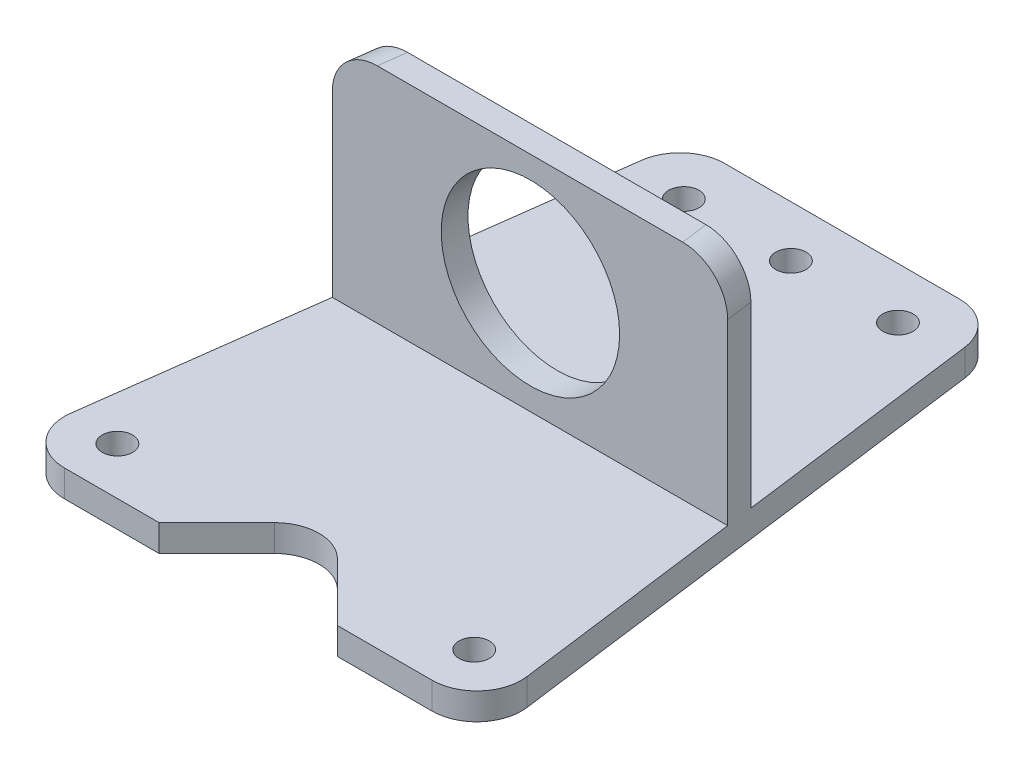
ISO-10303-21;
HEADER;
FILE_DESCRIPTION(('STEP AP214'),'2;1');
FILE_NAME('part.step','',(''),(''),'','','');
FILE_SCHEMA(('AUTOMOTIVE_DESIGN { 1 0 10303 214 1 1 1 1 }'));
ENDSEC;
DATA;
#1=APPLICATION_CONTEXT('core data for automotive mechanical design processes');
#2=APPLICATION_PROTOCOL_DEFINITION('international standard','automotive_design',2000,#1);
#3=PRODUCT_CONTEXT('',#1,'mechanical');
#4=PRODUCT('Part','Part','',(#3));
#5=PRODUCT_RELATED_PRODUCT_CATEGORY('part','',(#4));
#6=PRODUCT_DEFINITION_FORMATION('','',#4);
#7=PRODUCT_DEFINITION_CONTEXT('part definition',#1,'design');
#8=PRODUCT_DEFINITION('design','',#6,#7);
#9=PRODUCT_DEFINITION_SHAPE('','',#8);
#10=(LENGTH_UNIT() NAMED_UNIT(*) SI_UNIT(.MILLI.,.METRE.));
#11=(NAMED_UNIT(*) PLANE_ANGLE_UNIT() SI_UNIT($,.RADIAN.));
#12=(NAMED_UNIT(*) SI_UNIT($,.STERADIAN.) SOLID_ANGLE_UNIT());
#13=UNCERTAINTY_MEASURE_WITH_UNIT(LENGTH_MEASURE(1.E-05),#10,'distance_accuracy_value','');
#14=(GEOMETRIC_REPRESENTATION_CONTEXT(3) GLOBAL_UNCERTAINTY_ASSIGNED_CONTEXT((#13)) GLOBAL_UNIT_ASSIGNED_CONTEXT((#10,
#11,#12)) REPRESENTATION_CONTEXT('',''));
#15=CARTESIAN_POINT('',(0.,0.,0.));
#16=DIRECTION('',(0.,0.,1.));
#17=DIRECTION('',(1.,0.,0.));
#18=AXIS2_PLACEMENT_3D('',#15,#16,#17);
#19=CARTESIAN_POINT('',(0.,3.,549.377139365234));
#20=DIRECTION('',(0.,0.,-1.));
#21=DIRECTION('',(-1.,0.,0.));
#22=AXIS2_PLACEMENT_3D('',#19,#20,#21);
#23=PLANE('',#22);
#24=DIRECTION('',(1.,0.,0.));
#25=VECTOR('',#24,1.);
#26=CARTESIAN_POINT('',(0.,3.,549.377139365234));
#27=LINE('',#26,#25);
#28=CARTESIAN_POINT('',(-20.6154451047069,3.,549.377139365234));
#29=VERTEX_POINT('',#28);
#30=CARTESIAN_POINT('',(-9.99999999999981,3.,549.377139365234));
#31=VERTEX_POINT('',#30);
#32=EDGE_CURVE('E200',#29,#31,#27,.T.);
#33=ORIENTED_EDGE('',*,*,#32,.F.);
#34=DIRECTION('',(0.,-1.,0.));
#35=VECTOR('',#34,1.);
#36=CARTESIAN_POINT('',(-20.6154451047069,3.,549.377139365234));
#37=LINE('',#36,#35);
#38=CARTESIAN_POINT('',(-20.6154451047069,0.,549.377139365234));
#39=VERTEX_POINT('',#38);
#40=EDGE_CURVE('E316',#29,#39,#37,.T.);
#41=ORIENTED_EDGE('',*,*,#40,.T.);
#42=DIRECTION('',(1.,0.,0.));
#43=VECTOR('',#42,1.);
#44=CARTESIAN_POINT('',(0.,0.,549.377139365234));
#45=LINE('',#44,#43);
#46=CARTESIAN_POINT('',(-9.99999999999981,0.,549.377139365234));
#47=VERTEX_POINT('',#46);
#48=EDGE_CURVE('E243',#39,#47,#45,.T.);
#49=ORIENTED_EDGE('',*,*,#48,.T.);
#50=DIRECTION('',(0.,1.,0.));
#51=VECTOR('',#50,1.);
#52=CARTESIAN_POINT('',(-9.99999999999981,-7.,549.377139365234));
#53=LINE('',#52,#51);
#54=EDGE_CURVE('E184',#47,#31,#53,.T.);
#55=ORIENTED_EDGE('',*,*,#54,.T.);
#56=EDGE_LOOP('',(#33,#41,#49,#55));
#57=FACE_BOUND('',#56,.T.);
#58=ADVANCED_FACE('F45',(#57),#23,.F.);
#59=CARTESIAN_POINT('',(0.,3.,0.));
#60=DIRECTION('',(0.,1.,0.));
#61=DIRECTION('',(0.,0.,1.));
#62=AXIS2_PLACEMENT_3D('',#59,#60,#61);
#63=PLANE('',#62);
#64=DIRECTION('',(0.130449390800948,0.,0.991454969446249));
#65=VECTOR('',#64,1.);
#66=CARTESIAN_POINT('',(-45.1849462242018,3.,5.94515019841279));
#67=LINE('',#66,#65);
#68=CARTESIAN_POINT('',(18.1297543305561,3.,487.156094293981));
#69=VERTEX_POINT('',#68);
#70=CARTESIAN_POINT('',(21.7670135450569,3.,514.800368454553));
#71=VERTEX_POINT('',#70);
#72=EDGE_CURVE('E210',#69,#71,#67,.T.);
#73=ORIENTED_EDGE('',*,*,#72,.F.);
#74=CARTESIAN_POINT('',(13.1724794833249,3.,487.808341247986));
#75=DIRECTION('',(0.,1.,0.));
#76=DIRECTION('',(0.,0.,1.));
#77=AXIS2_PLACEMENT_3D('',#74,#75,#76);
#78=CIRCLE('',#77,5.);
#79=CARTESIAN_POINT('',(13.1724794833249,3.,482.808341247986));
#80=VERTEX_POINT('',#79);
#81=EDGE_CURVE('E61',#69,#80,#78,.T.);
#82=ORIENTED_EDGE('',*,*,#81,.T.);
#83=DIRECTION('',(1.,0.,0.));
#84=VECTOR('',#83,1.);
#85=CARTESIAN_POINT('',(0.,3.,482.808341247986));
#86=LINE('',#85,#84);
#87=CARTESIAN_POINT('',(-13.1724794833249,3.,482.808341247986));
#88=VERTEX_POINT('',#87);
#89=EDGE_CURVE('E214',#88,#80,#86,.T.);
#90=ORIENTED_EDGE('',*,*,#89,.F.);
#91=CARTESIAN_POINT('',(-13.1724794833249,3.,487.808341247986));
#92=DIRECTION('',(0.,1.,0.));
#93=DIRECTION('',(0.,0.,1.));
#94=AXIS2_PLACEMENT_3D('',#91,#92,#93);
#95=CIRCLE('',#94,5.);
#96=CARTESIAN_POINT('',(-18.1297543305561,3.,487.156094293981));
#97=VERTEX_POINT('',#96);
#98=EDGE_CURVE('E356',#88,#97,#95,.T.);
#99=ORIENTED_EDGE('',*,*,#98,.T.);
#100=DIRECTION('',(-0.130449390800948,0.,0.991454969446249));
#101=VECTOR('',#100,1.);
#102=CARTESIAN_POINT('',(45.1849462242018,3.,5.94515019841279));
#103=LINE('',#102,#101);
#104=CARTESIAN_POINT('',(-21.7670135450569,3.,514.800368454553));
#105=VERTEX_POINT('',#104);
#106=EDGE_CURVE('E201',#97,#105,#103,.T.);
#107=ORIENTED_EDGE('',*,*,#106,.T.);
#108=DIRECTION('',(-1.,0.,0.));
#109=VECTOR('',#108,1.);
#110=CARTESIAN_POINT('',(21.7670135450569,3.,514.800368454553));
#111=LINE('',#110,#109);
#112=EDGE_CURVE('E397',#71,#105,#111,.T.);
#113=ORIENTED_EDGE('',*,*,#112,.F.);
#114=EDGE_LOOP('',(#73,#82,#90,#99,#107,#113));
#115=FACE_BOUND('',#114,.T.);
#116=CARTESIAN_POINT('',(12.,3.,488.550368454553));
#117=DIRECTION('',(0.,1.,0.));
#118=DIRECTION('',(0.,0.,1.));
#119=AXIS2_PLACEMENT_3D('',#116,#117,#118);
#120=CIRCLE('',#119,1.69999999999994);
#121=CARTESIAN_POINT('',(12.,3.,490.250368454553));
#122=VERTEX_POINT('',#121);
#123=EDGE_CURVE('E225',#122,#122,#120,.F.);
#124=ORIENTED_EDGE('',*,*,#123,.T.);
#125=EDGE_LOOP('',(#124));
#126=FACE_BOUND('',#125,.T.);
#127=CARTESIAN_POINT('',(-12.,3.,488.550368454553));
#128=DIRECTION('',(0.,1.,0.));
#129=DIRECTION('',(0.,0.,1.));
#130=AXIS2_PLACEMENT_3D('',#127,#128,#129);
#131=CIRCLE('',#130,1.69999999999994);
#132=CARTESIAN_POINT('',(-12.,3.,490.250368454553));
#133=VERTEX_POINT('',#132);
#134=EDGE_CURVE('E221',#133,#133,#131,.T.);
#135=ORIENTED_EDGE('',*,*,#134,.F.);
#136=EDGE_LOOP('',(#135));
#137=FACE_BOUND('',#136,.T.);
#138=CARTESIAN_POINT('',(1.044746928557E-13,3.,488.550368454553));
#139=DIRECTION('',(0.,1.,0.));
#140=DIRECTION('',(0.,0.,1.));
#141=AXIS2_PLACEMENT_3D('',#138,#139,#140);
#142=CIRCLE('',#141,1.69999999999999);
#143=CARTESIAN_POINT('',(1.044746928557E-13,3.,490.250368454553));
#144=VERTEX_POINT('',#143);
#145=EDGE_CURVE('E217',#144,#144,#142,.T.);
#146=ORIENTED_EDGE('',*,*,#145,.F.);
#147=EDGE_LOOP('',(#146));
#148=FACE_BOUND('',#147,.T.);
#149=ADVANCED_FACE('F453',(#115,#126,#137,#148),#63,.T.);
#150=CARTESIAN_POINT('',(45.1849462242018,3.,5.94515019841279));
#151=DIRECTION('',(0.991454969446248,0.,0.130449390800948));
#152=DIRECTION('',(0.130449390800948,0.,-0.991454969446249));
#153=AXIS2_PLACEMENT_3D('',#150,#151,#152);
#154=PLANE('',#153);
#155=DIRECTION('',(-0.130449390800948,0.,0.991454969446249));
#156=VECTOR('',#155,1.);
#157=CARTESIAN_POINT('',(45.1849462242018,0.,5.94515019841279));
#158=LINE('',#157,#156);
#159=CARTESIAN_POINT('',(-18.1297543305561,0.,487.156094293981));
#160=VERTEX_POINT('',#159);
#161=CARTESIAN_POINT('',(-25.5727199519381,0.,543.724892411229));
#162=VERTEX_POINT('',#161);
#163=EDGE_CURVE('E238',#160,#162,#158,.T.);
#164=ORIENTED_EDGE('',*,*,#163,.T.);
#165=DIRECTION('',(0.,-1.,0.));
#166=VECTOR('',#165,1.);
#167=CARTESIAN_POINT('',(-25.5727199519381,3.,543.724892411229));
#168=LINE('',#167,#166);
#169=CARTESIAN_POINT('',(-25.5727199519381,3.,543.724892411229));
#170=VERTEX_POINT('',#169);
#171=EDGE_CURVE('E327',#162,#170,#168,.F.);
#172=ORIENTED_EDGE('',*,*,#171,.T.);
#173=CARTESIAN_POINT('',(-22.1617346211148,3.,517.800368454553));
#174=VERTEX_POINT('',#173);
#175=EDGE_CURVE('E206',#174,#170,#103,.T.);
#176=ORIENTED_EDGE('',*,*,#175,.F.);
#177=DIRECTION('',(0.,-1.,0.));
#178=VECTOR('',#177,1.);
#179=CARTESIAN_POINT('',(-22.1617346211148,28.,517.800368454553));
#180=LINE('',#179,#178);
#181=CARTESIAN_POINT('',(-22.1617346211148,23.,517.800368454553));
#182=VERTEX_POINT('',#181);
#183=EDGE_CURVE('E234',#182,#174,#180,.T.);
#184=ORIENTED_EDGE('',*,*,#183,.F.);
#185=DIRECTION('',(-0.130449390800948,0.,0.991454969446249));
#186=VECTOR('',#185,1.);
#187=CARTESIAN_POINT('',(45.1849462242018,23.,5.94515019841279));
#188=LINE('',#187,#186);
#189=CARTESIAN_POINT('',(-21.7670135450569,23.,514.800368454553));
#190=VERTEX_POINT('',#189);
#191=EDGE_CURVE('E324',#182,#190,#188,.F.);
#192=ORIENTED_EDGE('',*,*,#191,.T.);
#193=DIRECTION('',(0.,-1.,0.));
#194=VECTOR('',#193,1.);
#195=CARTESIAN_POINT('',(-21.7670135450569,28.,514.800368454553));
#196=LINE('',#195,#194);
#197=EDGE_CURVE('E385',#190,#105,#196,.T.);
#198=ORIENTED_EDGE('',*,*,#197,.T.);
#199=ORIENTED_EDGE('',*,*,#106,.F.);
#200=DIRECTION('',(0.,-1.,0.));
#201=VECTOR('',#200,1.);
#202=CARTESIAN_POINT('',(-18.1297543305561,0.,487.156094293981));
#203=LINE('',#202,#201);
#204=EDGE_CURVE('E320',#97,#160,#203,.T.);
#205=ORIENTED_EDGE('',*,*,#204,.T.);
#206=EDGE_LOOP('',(#164,#172,#176,#184,#192,#198,#199,#205));
#207=FACE_BOUND('',#206,.T.);
#208=ADVANCED_FACE('F458',(#207),#154,.F.);
#209=CARTESIAN_POINT('',(10.,0.,549.377139365234));
#210=VERTEX_POINT('',#209);
#211=CARTESIAN_POINT('',(20.6154451047069,0.,549.377139365234));
#212=VERTEX_POINT('',#211);
#213=EDGE_CURVE('E242',#210,#212,#45,.T.);
#214=ORIENTED_EDGE('',*,*,#213,.T.);
#215=DIRECTION('',(0.,-1.,0.));
#216=VECTOR('',#215,1.);
#217=CARTESIAN_POINT('',(20.6154451047069,3.,549.377139365234));
#218=LINE('',#217,#216);
#219=CARTESIAN_POINT('',(20.6154451047069,3.,549.377139365234));
#220=VERTEX_POINT('',#219);
#221=EDGE_CURVE('E198',#212,#220,#218,.F.);
#222=ORIENTED_EDGE('',*,*,#221,.T.);
#223=CARTESIAN_POINT('',(10.,3.,549.377139365234));
#224=VERTEX_POINT('',#223);
#225=EDGE_CURVE('E191',#224,#220,#27,.T.);
#226=ORIENTED_EDGE('',*,*,#225,.F.);
#227=DIRECTION('',(0.,1.,0.));
#228=VECTOR('',#227,1.);
#229=CARTESIAN_POINT('',(10.,-7.,549.377139365234));
#230=LINE('',#229,#228);
#231=EDGE_CURVE('E172',#210,#224,#230,.T.);
#232=ORIENTED_EDGE('',*,*,#231,.F.);
#233=EDGE_LOOP('',(#214,#222,#226,#232));
#234=FACE_BOUND('',#233,.T.);
#235=ADVANCED_FACE('F196',(#234),#23,.F.);
#236=CARTESIAN_POINT('',(-45.1849462242018,3.,5.94515019841279));
#237=DIRECTION('',(0.991454969446248,0.,-0.130449390800948));
#238=DIRECTION('',(-0.130449390800948,0.,-0.991454969446249));
#239=AXIS2_PLACEMENT_3D('',#236,#237,#238);
#240=PLANE('',#239);
#241=CARTESIAN_POINT('',(22.161734621115,3.,517.800368454553));
#242=VERTEX_POINT('',#241);
#243=CARTESIAN_POINT('',(25.5727199519381,3.,543.724892411229));
#244=VERTEX_POINT('',#243);
#245=EDGE_CURVE('E205',#242,#244,#67,.T.);
#246=ORIENTED_EDGE('',*,*,#245,.T.);
#247=DIRECTION('',(0.,-1.,0.));
#248=VECTOR('',#247,1.);
#249=CARTESIAN_POINT('',(25.5727199519381,0.,543.724892411229));
#250=LINE('',#249,#248);
#251=CARTESIAN_POINT('',(25.5727199519381,0.,543.724892411229));
#252=VERTEX_POINT('',#251);
#253=EDGE_CURVE('E292',#244,#252,#250,.T.);
#254=ORIENTED_EDGE('',*,*,#253,.T.);
#255=DIRECTION('',(0.130449390800948,0.,0.991454969446249));
#256=VECTOR('',#255,1.);
#257=CARTESIAN_POINT('',(-45.1849462242018,0.,5.94515019841279));
#258=LINE('',#257,#256);
#259=CARTESIAN_POINT('',(18.1297543305561,0.,487.156094293981));
#260=VERTEX_POINT('',#259);
#261=EDGE_CURVE('E246',#260,#252,#258,.T.);
#262=ORIENTED_EDGE('',*,*,#261,.F.);
#263=DIRECTION('',(0.,-1.,0.));
#264=VECTOR('',#263,1.);
#265=CARTESIAN_POINT('',(18.1297543305561,3.,487.156094293981));
#266=LINE('',#265,#264);
#267=EDGE_CURVE('E286',#260,#69,#266,.F.);
#268=ORIENTED_EDGE('',*,*,#267,.T.);
#269=ORIENTED_EDGE('',*,*,#72,.T.);
#270=DIRECTION('',(0.,-1.,0.));
#271=VECTOR('',#270,1.);
#272=CARTESIAN_POINT('',(21.7670135450569,28.,514.800368454553));
#273=LINE('',#272,#271);
#274=CARTESIAN_POINT('',(21.7670135450569,23.,514.800368454553));
#275=VERTEX_POINT('',#274);
#276=EDGE_CURVE('E382',#275,#71,#273,.T.);
#277=ORIENTED_EDGE('',*,*,#276,.F.);
#278=DIRECTION('',(-0.130449390800948,0.,-0.991454969446249));
#279=VECTOR('',#278,1.);
#280=CARTESIAN_POINT('',(22.1617346211149,23.,517.800368454553));
#281=LINE('',#280,#279);
#282=CARTESIAN_POINT('',(22.161734621115,23.,517.800368454553));
#283=VERTEX_POINT('',#282);
#284=EDGE_CURVE('E289',#275,#283,#281,.F.);
#285=ORIENTED_EDGE('',*,*,#284,.T.);
#286=DIRECTION('',(0.,-1.,0.));
#287=VECTOR('',#286,1.);
#288=CARTESIAN_POINT('',(22.161734621115,28.,517.800368454553));
#289=LINE('',#288,#287);
#290=EDGE_CURVE('E369',#283,#242,#289,.T.);
#291=ORIENTED_EDGE('',*,*,#290,.T.);
#292=EDGE_LOOP('',(#246,#254,#262,#268,#269,#277,#285,#291));
#293=FACE_BOUND('',#292,.T.);
#294=ADVANCED_FACE('F366',(#293),#240,.T.);
#295=CARTESIAN_POINT('',(-12.,3.,488.550368454553));
#296=DIRECTION('',(0.,-1.,0.));
#297=DIRECTION('',(0.,0.,-1.));
#298=AXIS2_PLACEMENT_3D('',#295,#296,#297);
#299=CYLINDRICAL_SURFACE('',#298,1.69999999999994);
#300=ORIENTED_EDGE('',*,*,#134,.T.);
#301=EDGE_LOOP('',(#300));
#302=FACE_BOUND('',#301,.T.);
#303=CARTESIAN_POINT('',(-12.,0.,488.550368454553));
#304=DIRECTION('',(0.,1.,0.));
#305=DIRECTION('',(0.,0.,1.));
#306=AXIS2_PLACEMENT_3D('',#303,#304,#305);
#307=CIRCLE('',#306,1.69999999999994);
#308=CARTESIAN_POINT('',(-12.,0.,490.250368454553));
#309=VERTEX_POINT('',#308);
#310=EDGE_CURVE('E258',#309,#309,#307,.T.);
#311=ORIENTED_EDGE('',*,*,#310,.F.);
#312=EDGE_LOOP('',(#311));
#313=FACE_BOUND('',#312,.T.);
#314=ADVANCED_FACE('F467',(#302,#313),#299,.F.);
#315=CARTESIAN_POINT('',(1.044746928557E-13,3.,488.550368454553));
#316=DIRECTION('',(0.,-1.,0.));
#317=DIRECTION('',(0.,0.,-1.));
#318=AXIS2_PLACEMENT_3D('',#315,#316,#317);
#319=CYLINDRICAL_SURFACE('',#318,1.69999999999999);
#320=ORIENTED_EDGE('',*,*,#145,.T.);
#321=EDGE_LOOP('',(#320));
#322=FACE_BOUND('',#321,.T.);
#323=CARTESIAN_POINT('',(1.044746928557E-13,0.,488.550368454553));
#324=DIRECTION('',(0.,1.,0.));
#325=DIRECTION('',(0.,0.,1.));
#326=AXIS2_PLACEMENT_3D('',#323,#324,#325);
#327=CIRCLE('',#326,1.69999999999999);
#328=CARTESIAN_POINT('',(1.044746928557E-13,0.,490.250368454553));
#329=VERTEX_POINT('',#328);
#330=EDGE_CURVE('E254',#329,#329,#327,.T.);
#331=ORIENTED_EDGE('',*,*,#330,.F.);
#332=EDGE_LOOP('',(#331));
#333=FACE_BOUND('',#332,.T.);
#334=ADVANCED_FACE('F543',(#322,#333),#319,.F.);
#335=CARTESIAN_POINT('',(0.,3.,482.808341247986));
#336=DIRECTION('',(0.,0.,-1.));
#337=DIRECTION('',(-1.,0.,0.));
#338=AXIS2_PLACEMENT_3D('',#335,#336,#337);
#339=PLANE('',#338);
#340=ORIENTED_EDGE('',*,*,#89,.T.);
#341=DIRECTION('',(0.,-1.,0.));
#342=VECTOR('',#341,1.);
#343=CARTESIAN_POINT('',(13.1724794833249,3.,482.808341247986));
#344=LINE('',#343,#342);
#345=CARTESIAN_POINT('',(13.1724794833249,0.,482.808341247986));
#346=VERTEX_POINT('',#345);
#347=EDGE_CURVE('E352',#80,#346,#344,.T.);
#348=ORIENTED_EDGE('',*,*,#347,.T.);
#349=DIRECTION('',(1.,0.,0.));
#350=VECTOR('',#349,1.);
#351=CARTESIAN_POINT('',(0.,0.,482.808341247986));
#352=LINE('',#351,#350);
#353=CARTESIAN_POINT('',(-13.1724794833249,0.,482.808341247986));
#354=VERTEX_POINT('',#353);
#355=EDGE_CURVE('E250',#354,#346,#352,.T.);
#356=ORIENTED_EDGE('',*,*,#355,.F.);
#357=DIRECTION('',(0.,-1.,0.));
#358=VECTOR('',#357,1.);
#359=CARTESIAN_POINT('',(-13.1724794833249,3.,482.808341247986));
#360=LINE('',#359,#358);
#361=EDGE_CURVE('E68',#354,#88,#360,.F.);
#362=ORIENTED_EDGE('',*,*,#361,.T.);
#363=EDGE_LOOP('',(#340,#348,#356,#362));
#364=FACE_BOUND('',#363,.T.);
#365=ADVANCED_FACE('F475',(#364),#339,.T.);
#366=CARTESIAN_POINT('',(-20.,3.,544.050368454553));
#367=DIRECTION('',(0.,-1.,0.));
#368=DIRECTION('',(0.,0.,-1.));
#369=AXIS2_PLACEMENT_3D('',#366,#367,#368);
#370=CYLINDRICAL_SURFACE('',#369,1.69999999999995);
#371=CARTESIAN_POINT('',(-20.,3.,544.050368454553));
#372=DIRECTION('',(0.,1.,0.));
#373=DIRECTION('',(0.,0.,1.));
#374=AXIS2_PLACEMENT_3D('',#371,#372,#373);
#375=CIRCLE('',#374,1.69999999999995);
#376=CARTESIAN_POINT('',(-20.,3.,545.750368454553));
#377=VERTEX_POINT('',#376);
#378=EDGE_CURVE('E417',#377,#377,#375,.T.);
#379=ORIENTED_EDGE('',*,*,#378,.T.);
#380=EDGE_LOOP('',(#379));
#381=FACE_BOUND('',#380,.T.);
#382=CARTESIAN_POINT('',(-20.,0.,544.050368454553));
#383=DIRECTION('',(0.,1.,0.));
#384=DIRECTION('',(0.,0.,1.));
#385=AXIS2_PLACEMENT_3D('',#382,#383,#384);
#386=CIRCLE('',#385,1.69999999999995);
#387=CARTESIAN_POINT('',(-20.,0.,545.750368454553));
#388=VERTEX_POINT('',#387);
#389=EDGE_CURVE('E233',#388,#388,#386,.T.);
#390=ORIENTED_EDGE('',*,*,#389,.F.);
#391=EDGE_LOOP('',(#390));
#392=FACE_BOUND('',#391,.T.);
#393=ADVANCED_FACE('F471',(#381,#392),#370,.F.);
#394=CARTESIAN_POINT('',(20.0000000000001,3.,544.050368454553));
#395=DIRECTION('',(0.,-1.,0.));
#396=DIRECTION('',(0.,0.,-1.));
#397=AXIS2_PLACEMENT_3D('',#394,#395,#396);
#398=CYLINDRICAL_SURFACE('',#397,1.69999999999985);
#399=CARTESIAN_POINT('',(20.0000000000001,3.,544.050368454553));
#400=DIRECTION('',(0.,1.,0.));
#401=DIRECTION('',(0.,0.,1.));
#402=AXIS2_PLACEMENT_3D('',#399,#400,#401);
#403=CIRCLE('',#402,1.69999999999985);
#404=CARTESIAN_POINT('',(20.0000000000001,3.,545.750368454553));
#405=VERTEX_POINT('',#404);
#406=EDGE_CURVE('E266',#405,#405,#403,.F.);
#407=ORIENTED_EDGE('',*,*,#406,.F.);
#408=EDGE_LOOP('',(#407));
#409=FACE_BOUND('',#408,.T.);
#410=CARTESIAN_POINT('',(20.0000000000001,0.,544.050368454553));
#411=DIRECTION('',(0.,1.,0.));
#412=DIRECTION('',(0.,0.,1.));
#413=AXIS2_PLACEMENT_3D('',#410,#411,#412);
#414=CIRCLE('',#413,1.69999999999985);
#415=CARTESIAN_POINT('',(20.0000000000001,0.,545.750368454553));
#416=VERTEX_POINT('',#415);
#417=EDGE_CURVE('E229',#416,#416,#414,.F.);
#418=ORIENTED_EDGE('',*,*,#417,.T.);
#419=EDGE_LOOP('',(#418));
#420=FACE_BOUND('',#419,.T.);
#421=ADVANCED_FACE('F474',(#409,#420),#398,.F.);
#422=CARTESIAN_POINT('',(12.,3.,488.550368454553));
#423=DIRECTION('',(0.,-1.,0.));
#424=DIRECTION('',(0.,0.,-1.));
#425=AXIS2_PLACEMENT_3D('',#422,#423,#424);
#426=CYLINDRICAL_SURFACE('',#425,1.69999999999994);
#427=ORIENTED_EDGE('',*,*,#123,.F.);
#428=EDGE_LOOP('',(#427));
#429=FACE_BOUND('',#428,.T.);
#430=CARTESIAN_POINT('',(12.,0.,488.550368454553));
#431=DIRECTION('',(0.,1.,0.));
#432=DIRECTION('',(0.,0.,1.));
#433=AXIS2_PLACEMENT_3D('',#430,#431,#432);
#434=CIRCLE('',#433,1.69999999999994);
#435=CARTESIAN_POINT('',(12.,0.,490.250368454553));
#436=VERTEX_POINT('',#435);
#437=EDGE_CURVE('E262',#436,#436,#434,.F.);
#438=ORIENTED_EDGE('',*,*,#437,.T.);
#439=EDGE_LOOP('',(#438));
#440=FACE_BOUND('',#439,.T.);
#441=ADVANCED_FACE('F478',(#429,#440),#426,.F.);
#442=ORIENTED_EDGE('',*,*,#225,.T.);
#443=CARTESIAN_POINT('',(20.6154451047069,3.,544.377139365234));
#444=DIRECTION('',(0.,1.,0.));
#445=DIRECTION('',(0.,0.,1.));
#446=AXIS2_PLACEMENT_3D('',#443,#444,#445);
#447=CIRCLE('',#446,5.);
#448=EDGE_CURVE('E313',#220,#244,#447,.T.);
#449=ORIENTED_EDGE('',*,*,#448,.T.);
#450=ORIENTED_EDGE('',*,*,#245,.F.);
#451=DIRECTION('',(1.,0.,0.));
#452=VECTOR('',#451,1.);
#453=CARTESIAN_POINT('',(22.161734621115,3.,517.800368454553));
#454=LINE('',#453,#452);
#455=EDGE_CURVE('E271',#174,#242,#454,.T.);
#456=ORIENTED_EDGE('',*,*,#455,.F.);
#457=ORIENTED_EDGE('',*,*,#175,.T.);
#458=CARTESIAN_POINT('',(-20.6154451047069,3.,544.377139365234));
#459=DIRECTION('',(0.,1.,0.));
#460=DIRECTION('',(0.,0.,1.));
#461=AXIS2_PLACEMENT_3D('',#458,#459,#460);
#462=CIRCLE('',#461,5.);
#463=EDGE_CURVE('E310',#170,#29,#462,.T.);
#464=ORIENTED_EDGE('',*,*,#463,.T.);
#465=ORIENTED_EDGE('',*,*,#32,.T.);
#466=DIRECTION('',(-0.707106781186544,0.,0.707106781186551));
#467=VECTOR('',#466,1.);
#468=CARTESIAN_POINT('',(0.,3.,539.377139365234));
#469=LINE('',#468,#467);
#470=CARTESIAN_POINT('',(-3.53553390593272,3.,542.912673271167));
#471=VERTEX_POINT('',#470);
#472=EDGE_CURVE('E185',#471,#31,#469,.T.);
#473=ORIENTED_EDGE('',*,*,#472,.F.);
#474=CARTESIAN_POINT('',(0.,3.,546.4482071771));
#475=DIRECTION('',(0.,1.,0.));
#476=DIRECTION('',(0.,0.,1.));
#477=AXIS2_PLACEMENT_3D('',#474,#475,#476);
#478=CIRCLE('',#477,5.);
#479=CARTESIAN_POINT('',(3.53553390593278,3.,542.912673271167));
#480=VERTEX_POINT('',#479);
#481=EDGE_CURVE('E54',#471,#480,#478,.F.);
#482=ORIENTED_EDGE('',*,*,#481,.T.);
#483=DIRECTION('',(-0.707106781186551,0.,-0.707106781186544));
#484=VECTOR('',#483,1.);
#485=CARTESIAN_POINT('',(10.,3.,549.377139365234));
#486=LINE('',#485,#484);
#487=EDGE_CURVE('E175',#224,#480,#486,.T.);
#488=ORIENTED_EDGE('',*,*,#487,.F.);
#489=EDGE_LOOP('',(#442,#449,#450,#456,#457,#464,#465,#473,#482,#488));
#490=FACE_BOUND('',#489,.T.);
#491=ORIENTED_EDGE('',*,*,#406,.T.);
#492=EDGE_LOOP('',(#491));
#493=FACE_BOUND('',#492,.T.);
#494=ORIENTED_EDGE('',*,*,#378,.F.);
#495=EDGE_LOOP('',(#494));
#496=FACE_BOUND('',#495,.T.);
#497=ADVANCED_FACE('F189',(#490,#493,#496),#63,.T.);
#498=CARTESIAN_POINT('',(0.,0.,0.));
#499=DIRECTION('',(0.,1.,0.));
#500=DIRECTION('',(0.,0.,1.));
#501=AXIS2_PLACEMENT_3D('',#498,#499,#500);
#502=PLANE('',#501);
#503=ORIENTED_EDGE('',*,*,#417,.F.);
#504=EDGE_LOOP('',(#503));
#505=FACE_BOUND('',#504,.T.);
#506=ORIENTED_EDGE('',*,*,#389,.T.);
#507=EDGE_LOOP('',(#506));
#508=FACE_BOUND('',#507,.T.);
#509=ORIENTED_EDGE('',*,*,#261,.T.);
#510=CARTESIAN_POINT('',(20.6154451047069,0.,544.377139365234));
#511=DIRECTION('',(0.,1.,0.));
#512=DIRECTION('',(0.,0.,1.));
#513=AXIS2_PLACEMENT_3D('',#510,#511,#512);
#514=CIRCLE('',#513,5.);
#515=EDGE_CURVE('E305',#252,#212,#514,.F.);
#516=ORIENTED_EDGE('',*,*,#515,.T.);
#517=ORIENTED_EDGE('',*,*,#213,.F.);
#518=DIRECTION('',(-0.707106781186551,0.,-0.707106781186544));
#519=VECTOR('',#518,1.);
#520=CARTESIAN_POINT('',(-269.688569682617,0.,269.68856968262));
#521=LINE('',#520,#519);
#522=CARTESIAN_POINT('',(3.53553390593281,0.,542.912673271167));
#523=VERTEX_POINT('',#522);
#524=EDGE_CURVE('E178',#210,#523,#521,.T.);
#525=ORIENTED_EDGE('',*,*,#524,.T.);
#526=CARTESIAN_POINT('',(0.,0.,546.4482071771));
#527=DIRECTION('',(0.,1.,0.));
#528=DIRECTION('',(0.,0.,1.));
#529=AXIS2_PLACEMENT_3D('',#526,#527,#528);
#530=CIRCLE('',#529,5.);
#531=CARTESIAN_POINT('',(-3.5355339059327,0.,542.912673271167));
#532=VERTEX_POINT('',#531);
#533=EDGE_CURVE('E11',#523,#532,#530,.T.);
#534=ORIENTED_EDGE('',*,*,#533,.T.);
#535=DIRECTION('',(-0.707106781186544,0.,0.707106781186551));
#536=VECTOR('',#535,1.);
#537=CARTESIAN_POINT('',(269.688569682617,0.,269.688569682615));
#538=LINE('',#537,#536);
#539=EDGE_CURVE('E275',#532,#47,#538,.T.);
#540=ORIENTED_EDGE('',*,*,#539,.T.);
#541=ORIENTED_EDGE('',*,*,#48,.F.);
#542=CARTESIAN_POINT('',(-20.6154451047069,0.,544.377139365234));
#543=DIRECTION('',(0.,1.,0.));
#544=DIRECTION('',(0.,0.,1.));
#545=AXIS2_PLACEMENT_3D('',#542,#543,#544);
#546=CIRCLE('',#545,5.);
#547=EDGE_CURVE('E302',#39,#162,#546,.F.);
#548=ORIENTED_EDGE('',*,*,#547,.T.);
#549=ORIENTED_EDGE('',*,*,#163,.F.);
#550=CARTESIAN_POINT('',(-13.1724794833249,0.,487.808341247986));
#551=DIRECTION('',(0.,1.,0.));
#552=DIRECTION('',(0.,0.,1.));
#553=AXIS2_PLACEMENT_3D('',#550,#551,#552);
#554=CIRCLE('',#553,5.);
#555=EDGE_CURVE('E296',#160,#354,#554,.F.);
#556=ORIENTED_EDGE('',*,*,#555,.T.);
#557=ORIENTED_EDGE('',*,*,#355,.T.);
#558=CARTESIAN_POINT('',(13.1724794833249,0.,487.808341247986));
#559=DIRECTION('',(0.,1.,0.));
#560=DIRECTION('',(0.,0.,1.));
#561=AXIS2_PLACEMENT_3D('',#558,#559,#560);
#562=CIRCLE('',#561,5.);
#563=EDGE_CURVE('E299',#346,#260,#562,.F.);
#564=ORIENTED_EDGE('',*,*,#563,.T.);
#565=EDGE_LOOP('',(#509,#516,#517,#525,#534,#540,#541,#548,#549,#556,#557,#564));
#566=FACE_BOUND('',#565,.T.);
#567=ORIENTED_EDGE('',*,*,#330,.T.);
#568=EDGE_LOOP('',(#567));
#569=FACE_BOUND('',#568,.T.);
#570=ORIENTED_EDGE('',*,*,#310,.T.);
#571=EDGE_LOOP('',(#570));
#572=FACE_BOUND('',#571,.T.);
#573=ORIENTED_EDGE('',*,*,#437,.F.);
#574=EDGE_LOOP('',(#573));
#575=FACE_BOUND('',#574,.T.);
#576=ADVANCED_FACE('F375',(#505,#508,#566,#569,#572,#575),#502,.F.);
#577=CARTESIAN_POINT('',(22.161734621115,28.,517.800368454553));
#578=DIRECTION('',(0.,0.,-1.));
#579=DIRECTION('',(-1.,0.,0.));
#580=AXIS2_PLACEMENT_3D('',#577,#578,#579);
#581=PLANE('',#580);
#582=CARTESIAN_POINT('',(0.0514451079993705,15.4980346673425,517.800368454553));
#583=DIRECTION('',(0.,0.,1.));
#584=DIRECTION('',(1.,0.,0.));
#585=AXIS2_PLACEMENT_3D('',#582,#583,#584);
#586=CIRCLE('',#585,10.);
#587=CARTESIAN_POINT('',(10.0514451079994,15.4980346673425,517.800368454553));
#588=VERTEX_POINT('',#587);
#589=EDGE_CURVE('E272',#588,#588,#586,.T.);
#590=ORIENTED_EDGE('',*,*,#589,.F.);
#591=EDGE_LOOP('',(#590));
#592=FACE_BOUND('',#591,.T.);
#593=DIRECTION('',(1.,0.,0.));
#594=VECTOR('',#593,1.);
#595=CARTESIAN_POINT('',(22.161734621115,28.,517.800368454553));
#596=LINE('',#595,#594);
#597=CARTESIAN_POINT('',(-17.1186412340368,28.,517.800368454553));
#598=VERTEX_POINT('',#597);
#599=CARTESIAN_POINT('',(17.1186412340369,28.,517.800368454553));
#600=VERTEX_POINT('',#599);
#601=EDGE_CURVE('E393',#598,#600,#596,.T.);
#602=ORIENTED_EDGE('',*,*,#601,.F.);
#603=CARTESIAN_POINT('',(-17.1186412340368,23.,517.800368454553));
#604=DIRECTION('',(0.,0.,-1.));
#605=DIRECTION('',(-1.,0.,0.));
#606=AXIS2_PLACEMENT_3D('',#603,#604,#605);
#607=ELLIPSE('',#606,5.043093387078,5.);
#608=EDGE_CURVE('E341',#598,#182,#607,.F.);
#609=ORIENTED_EDGE('',*,*,#608,.T.);
#610=ORIENTED_EDGE('',*,*,#183,.T.);
#611=ORIENTED_EDGE('',*,*,#455,.T.);
#612=ORIENTED_EDGE('',*,*,#290,.F.);
#613=CARTESIAN_POINT('',(17.1186412340368,23.,517.800368454553));
#614=DIRECTION('',(0.,0.,-1.));
#615=DIRECTION('',(1.,0.,0.));
#616=AXIS2_PLACEMENT_3D('',#613,#614,#615);
#617=ELLIPSE('',#616,5.043093387078,5.);
#618=EDGE_CURVE('E338',#283,#600,#617,.F.);
#619=ORIENTED_EDGE('',*,*,#618,.T.);
#620=EDGE_LOOP('',(#602,#609,#610,#611,#612,#619));
#621=FACE_BOUND('',#620,.T.);
#622=ADVANCED_FACE('F519',(#592,#621),#581,.F.);
#623=CARTESIAN_POINT('',(21.7670135450569,28.,514.800368454553));
#624=DIRECTION('',(0.,0.,1.));
#625=DIRECTION('',(1.,0.,0.));
#626=AXIS2_PLACEMENT_3D('',#623,#624,#625);
#627=PLANE('',#626);
#628=CARTESIAN_POINT('',(0.0514451079993705,15.4980346673425,514.800368454553));
#629=DIRECTION('',(0.,0.,1.));
#630=DIRECTION('',(1.,0.,0.));
#631=AXIS2_PLACEMENT_3D('',#628,#629,#630);
#632=CIRCLE('',#631,10.);
#633=CARTESIAN_POINT('',(10.0514451079994,15.4980346673425,514.800368454553));
#634=VERTEX_POINT('',#633);
#635=EDGE_CURVE('E267',#634,#634,#632,.T.);
#636=ORIENTED_EDGE('',*,*,#635,.T.);
#637=EDGE_LOOP('',(#636));
#638=FACE_BOUND('',#637,.T.);
#639=ORIENTED_EDGE('',*,*,#197,.F.);
#640=CARTESIAN_POINT('',(-16.7239201579789,23.,514.800368454553));
#641=DIRECTION('',(0.,0.,1.));
#642=DIRECTION('',(-1.,0.,0.));
#643=AXIS2_PLACEMENT_3D('',#640,#641,#642);
#644=ELLIPSE('',#643,5.043093387078,5.);
#645=CARTESIAN_POINT('',(-16.7239201579789,28.,514.800368454553));
#646=VERTEX_POINT('',#645);
#647=EDGE_CURVE('E347',#190,#646,#644,.F.);
#648=ORIENTED_EDGE('',*,*,#647,.T.);
#649=DIRECTION('',(-1.,0.,0.));
#650=VECTOR('',#649,1.);
#651=CARTESIAN_POINT('',(21.7670135450569,28.,514.800368454553));
#652=LINE('',#651,#650);
#653=CARTESIAN_POINT('',(16.7239201579789,28.,514.800368454553));
#654=VERTEX_POINT('',#653);
#655=EDGE_CURVE('E389',#654,#646,#652,.T.);
#656=ORIENTED_EDGE('',*,*,#655,.F.);
#657=CARTESIAN_POINT('',(16.7239201579789,23.,514.800368454553));
#658=DIRECTION('',(0.,0.,1.));
#659=DIRECTION('',(1.,0.,0.));
#660=AXIS2_PLACEMENT_3D('',#657,#658,#659);
#661=ELLIPSE('',#660,5.043093387078,5.);
#662=EDGE_CURVE('E344',#654,#275,#661,.F.);
#663=ORIENTED_EDGE('',*,*,#662,.T.);
#664=ORIENTED_EDGE('',*,*,#276,.T.);
#665=ORIENTED_EDGE('',*,*,#112,.T.);
#666=EDGE_LOOP('',(#639,#648,#656,#663,#664,#665));
#667=FACE_BOUND('',#666,.T.);
#668=ADVANCED_FACE('F510',(#638,#667),#627,.F.);
#669=CARTESIAN_POINT('',(0.,28.,0.));
#670=DIRECTION('',(0.,-1.,0.));
#671=DIRECTION('',(0.,0.,-1.));
#672=AXIS2_PLACEMENT_3D('',#669,#670,#671);
#673=PLANE('',#672);
#674=ORIENTED_EDGE('',*,*,#655,.T.);
#675=DIRECTION('',(-0.130449390800948,0.,0.991454969446249));
#676=VECTOR('',#675,1.);
#677=CARTESIAN_POINT('',(50.142221071433,28.,6.59739715241753));
#678=LINE('',#677,#676);
#679=EDGE_CURVE('E334',#646,#598,#678,.T.);
#680=ORIENTED_EDGE('',*,*,#679,.T.);
#681=ORIENTED_EDGE('',*,*,#601,.T.);
#682=DIRECTION('',(-0.130449390800948,0.,-0.991454969446249));
#683=VECTOR('',#682,1.);
#684=CARTESIAN_POINT('',(16.8097386978257,28.,515.452615408558));
#685=LINE('',#684,#683);
#686=EDGE_CURVE('E330',#600,#654,#685,.T.);
#687=ORIENTED_EDGE('',*,*,#686,.T.);
#688=EDGE_LOOP('',(#674,#680,#681,#687));
#689=FACE_BOUND('',#688,.T.);
#690=ADVANCED_FACE('F449',(#689),#673,.F.);
#691=CARTESIAN_POINT('',(0.0514451079993705,15.4980346673425,507.800368454553));
#692=DIRECTION('',(0.,0.,1.));
#693=DIRECTION('',(1.,0.,0.));
#694=AXIS2_PLACEMENT_3D('',#691,#692,#693);
#695=CYLINDRICAL_SURFACE('',#694,10.);
#696=ORIENTED_EDGE('',*,*,#589,.T.);
#697=EDGE_LOOP('',(#696));
#698=FACE_BOUND('',#697,.T.);
#699=ORIENTED_EDGE('',*,*,#635,.F.);
#700=EDGE_LOOP('',(#699));
#701=FACE_BOUND('',#700,.T.);
#702=ADVANCED_FACE('F441',(#698,#701),#695,.F.);
#703=CARTESIAN_POINT('',(0.,-7.,539.377139365234));
#704=DIRECTION('',(-0.707106781186551,0.,-0.707106781186544));
#705=DIRECTION('',(-0.707106781186544,0.,0.707106781186551));
#706=AXIS2_PLACEMENT_3D('',#703,#704,#705);
#707=PLANE('',#706);
#708=ORIENTED_EDGE('',*,*,#539,.F.);
#709=DIRECTION('',(0.,1.,0.));
#710=VECTOR('',#709,1.);
#711=CARTESIAN_POINT('',(-3.53553390593272,3.,542.912673271167));
#712=LINE('',#711,#710);
#713=EDGE_CURVE('E279',#532,#471,#712,.T.);
#714=ORIENTED_EDGE('',*,*,#713,.T.);
#715=ORIENTED_EDGE('',*,*,#472,.T.);
#716=ORIENTED_EDGE('',*,*,#54,.F.);
#717=EDGE_LOOP('',(#708,#714,#715,#716));
#718=FACE_BOUND('',#717,.T.);
#719=ADVANCED_FACE('F439',(#718),#707,.F.);
#720=CARTESIAN_POINT('',(10.,-7.,549.377139365234));
#721=DIRECTION('',(0.707106781186544,0.,-0.707106781186551));
#722=DIRECTION('',(-0.707106781186551,0.,-0.707106781186544));
#723=AXIS2_PLACEMENT_3D('',#720,#721,#722);
#724=PLANE('',#723);
#725=ORIENTED_EDGE('',*,*,#487,.T.);
#726=DIRECTION('',(0.,1.,0.));
#727=VECTOR('',#726,1.);
#728=CARTESIAN_POINT('',(3.53553390593278,0.,542.912673271167));
#729=LINE('',#728,#727);
#730=EDGE_CURVE('E283',#480,#523,#729,.F.);
#731=ORIENTED_EDGE('',*,*,#730,.T.);
#732=ORIENTED_EDGE('',*,*,#524,.F.);
#733=ORIENTED_EDGE('',*,*,#231,.T.);
#734=EDGE_LOOP('',(#725,#731,#732,#733));
#735=FACE_BOUND('',#734,.T.);
#736=ADVANCED_FACE('F174',(#735),#724,.F.);
#737=CARTESIAN_POINT('',(0.,-7.,546.4482071771));
#738=DIRECTION('',(0.,-1.,0.));
#739=DIRECTION('',(0.,0.,-1.));
#740=AXIS2_PLACEMENT_3D('',#737,#738,#739);
#741=CYLINDRICAL_SURFACE('',#740,5.);
#742=ORIENTED_EDGE('',*,*,#533,.F.);
#743=ORIENTED_EDGE('',*,*,#730,.F.);
#744=ORIENTED_EDGE('',*,*,#481,.F.);
#745=ORIENTED_EDGE('',*,*,#713,.F.);
#746=EDGE_LOOP('',(#742,#743,#744,#745));
#747=FACE_BOUND('',#746,.T.);
#748=ADVANCED_FACE('F447',(#747),#741,.F.);
#749=CARTESIAN_POINT('',(20.6154451047069,3.,544.377139365234));
#750=DIRECTION('',(0.,1.,0.));
#751=DIRECTION('',(0.,0.,1.));
#752=AXIS2_PLACEMENT_3D('',#749,#750,#751);
#753=CYLINDRICAL_SURFACE('',#752,5.);
#754=ORIENTED_EDGE('',*,*,#448,.F.);
#755=ORIENTED_EDGE('',*,*,#221,.F.);
#756=ORIENTED_EDGE('',*,*,#515,.F.);
#757=ORIENTED_EDGE('',*,*,#253,.F.);
#758=EDGE_LOOP('',(#754,#755,#756,#757));
#759=FACE_BOUND('',#758,.T.);
#760=ADVANCED_FACE('F373',(#759),#753,.T.);
#761=CARTESIAN_POINT('',(-20.6154451047069,3.,544.377139365234));
#762=DIRECTION('',(0.,-1.,0.));
#763=DIRECTION('',(0.,0.,-1.));
#764=AXIS2_PLACEMENT_3D('',#761,#762,#763);
#765=CYLINDRICAL_SURFACE('',#764,5.);
#766=ORIENTED_EDGE('',*,*,#463,.F.);
#767=ORIENTED_EDGE('',*,*,#171,.F.);
#768=ORIENTED_EDGE('',*,*,#547,.F.);
#769=ORIENTED_EDGE('',*,*,#40,.F.);
#770=EDGE_LOOP('',(#766,#767,#768,#769));
#771=FACE_BOUND('',#770,.T.);
#772=ADVANCED_FACE('F432',(#771),#765,.T.);
#773=CARTESIAN_POINT('',(50.142221071433,23.,6.59739715241753));
#774=DIRECTION('',(-0.130449390800948,0.,0.991454969446249));
#775=DIRECTION('',(0.991454969446249,0.,0.130449390800948));
#776=AXIS2_PLACEMENT_3D('',#773,#774,#775);
#777=CYLINDRICAL_SURFACE('',#776,5.);
#778=ORIENTED_EDGE('',*,*,#647,.F.);
#779=ORIENTED_EDGE('',*,*,#191,.F.);
#780=ORIENTED_EDGE('',*,*,#608,.F.);
#781=ORIENTED_EDGE('',*,*,#679,.F.);
#782=EDGE_LOOP('',(#778,#779,#780,#781));
#783=FACE_BOUND('',#782,.T.);
#784=ADVANCED_FACE('F487',(#783),#777,.T.);
#785=CARTESIAN_POINT('',(-50.142221071433,23.,6.59739715241753));
#786=DIRECTION('',(0.130449390800948,0.,0.991454969446249));
#787=DIRECTION('',(0.991454969446249,0.,-0.130449390800948));
#788=AXIS2_PLACEMENT_3D('',#785,#786,#787);
#789=CYLINDRICAL_SURFACE('',#788,5.);
#790=ORIENTED_EDGE('',*,*,#618,.F.);
#791=ORIENTED_EDGE('',*,*,#284,.F.);
#792=ORIENTED_EDGE('',*,*,#662,.F.);
#793=ORIENTED_EDGE('',*,*,#686,.F.);
#794=EDGE_LOOP('',(#790,#791,#792,#793));
#795=FACE_BOUND('',#794,.T.);
#796=ADVANCED_FACE('F490',(#795),#789,.T.);
#797=CARTESIAN_POINT('',(13.1724794833249,3.,487.808341247986));
#798=DIRECTION('',(0.,-1.,0.));
#799=DIRECTION('',(0.,0.,-1.));
#800=AXIS2_PLACEMENT_3D('',#797,#798,#799);
#801=CYLINDRICAL_SURFACE('',#800,5.);
#802=ORIENTED_EDGE('',*,*,#81,.F.);
#803=ORIENTED_EDGE('',*,*,#267,.F.);
#804=ORIENTED_EDGE('',*,*,#563,.F.);
#805=ORIENTED_EDGE('',*,*,#347,.F.);
#806=EDGE_LOOP('',(#802,#803,#804,#805));
#807=FACE_BOUND('',#806,.T.);
#808=ADVANCED_FACE('F493',(#807),#801,.T.);
#809=CARTESIAN_POINT('',(-13.1724794833249,3.,487.808341247986));
#810=DIRECTION('',(0.,1.,0.));
#811=DIRECTION('',(0.,0.,1.));
#812=AXIS2_PLACEMENT_3D('',#809,#810,#811);
#813=CYLINDRICAL_SURFACE('',#812,5.);
#814=ORIENTED_EDGE('',*,*,#98,.F.);
#815=ORIENTED_EDGE('',*,*,#361,.F.);
#816=ORIENTED_EDGE('',*,*,#555,.F.);
#817=ORIENTED_EDGE('',*,*,#204,.F.);
#818=EDGE_LOOP('',(#814,#815,#816,#817));
#819=FACE_BOUND('',#818,.T.);
#820=ADVANCED_FACE('F47',(#819),#813,.T.);
#821=CLOSED_SHELL('',(#58,#149,#208,#235,#294,#314,#334,#365,#393,#421,#441,#497,#576,#622,#668,
#690,#702,#719,#736,#748,#760,#772,#784,#796,#808,#820));
#822=MANIFOLD_SOLID_BREP('B2',#821);
#823=ADVANCED_BREP_SHAPE_REPRESENTATION('',(#18,#822),#14);
#824=SHAPE_DEFINITION_REPRESENTATION(#9,#823);
ENDSEC;
END-ISO-10303-21;
